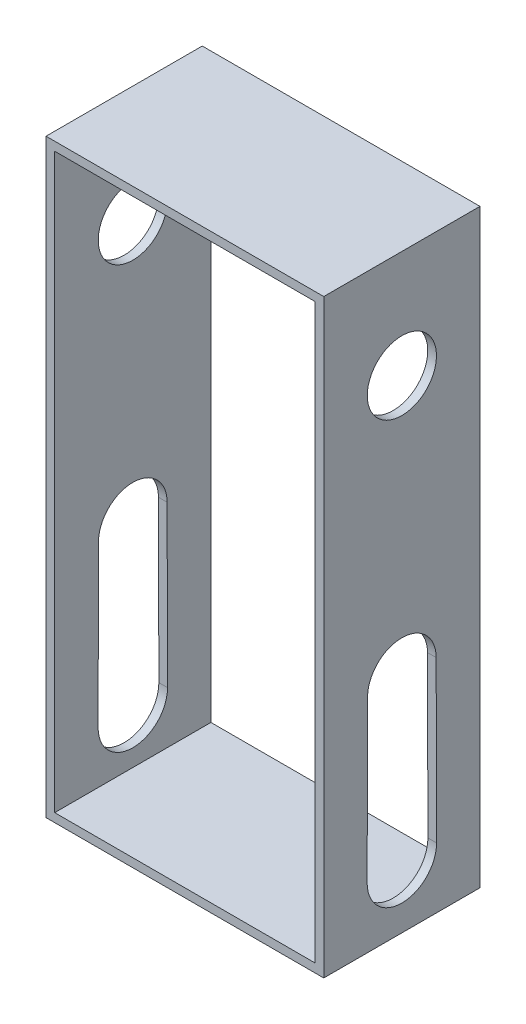
ISO-10303-21;
HEADER;
FILE_DESCRIPTION(('STEP AP214'),'2;1');
FILE_NAME('part.step','',(''),(''),'','','');
FILE_SCHEMA(('AUTOMOTIVE_DESIGN { 1 0 10303 214 1 1 1 1 }'));
ENDSEC;
DATA;
#1=APPLICATION_CONTEXT('core data for automotive mechanical design processes');
#2=APPLICATION_PROTOCOL_DEFINITION('international standard','automotive_design',2000,#1);
#3=PRODUCT_CONTEXT('',#1,'mechanical');
#4=PRODUCT('Part','Part','',(#3));
#5=PRODUCT_RELATED_PRODUCT_CATEGORY('part','',(#4));
#6=PRODUCT_DEFINITION_FORMATION('','',#4);
#7=PRODUCT_DEFINITION_CONTEXT('part definition',#1,'design');
#8=PRODUCT_DEFINITION('design','',#6,#7);
#9=PRODUCT_DEFINITION_SHAPE('','',#8);
#10=(LENGTH_UNIT() NAMED_UNIT(*) SI_UNIT(.MILLI.,.METRE.));
#11=(NAMED_UNIT(*) PLANE_ANGLE_UNIT() SI_UNIT($,.RADIAN.));
#12=(NAMED_UNIT(*) SI_UNIT($,.STERADIAN.) SOLID_ANGLE_UNIT());
#13=UNCERTAINTY_MEASURE_WITH_UNIT(LENGTH_MEASURE(1.E-05),#10,'distance_accuracy_value','');
#14=(GEOMETRIC_REPRESENTATION_CONTEXT(3) GLOBAL_UNCERTAINTY_ASSIGNED_CONTEXT((#13)) GLOBAL_UNIT_ASSIGNED_CONTEXT((#10,
#11,#12)) REPRESENTATION_CONTEXT('',''));
#15=CARTESIAN_POINT('',(0.,0.,0.));
#16=DIRECTION('',(0.,0.,1.));
#17=DIRECTION('',(1.,0.,0.));
#18=AXIS2_PLACEMENT_3D('',#15,#16,#17);
#19=CARTESIAN_POINT('',(0.,0.,114.3));
#20=DIRECTION('',(0.,0.,-1.));
#21=DIRECTION('',(-1.,0.,0.));
#22=AXIS2_PLACEMENT_3D('',#19,#20,#21);
#23=PLANE('',#22);
#24=DIRECTION('',(0.,1.,0.));
#25=VECTOR('',#24,1.);
#26=CARTESIAN_POINT('',(101.6,-215.9,114.3));
#27=LINE('',#26,#25);
#28=CARTESIAN_POINT('',(101.6,-215.9,114.3));
#29=VERTEX_POINT('',#28);
#30=CARTESIAN_POINT('',(101.6,215.9,114.3));
#31=VERTEX_POINT('',#30);
#32=EDGE_CURVE('E269',#29,#31,#27,.T.);
#33=ORIENTED_EDGE('',*,*,#32,.T.);
#34=DIRECTION('',(-1.,0.,0.));
#35=VECTOR('',#34,1.);
#36=CARTESIAN_POINT('',(-101.6,215.9,114.3));
#37=LINE('',#36,#35);
#38=CARTESIAN_POINT('',(-101.6,215.9,114.3));
#39=VERTEX_POINT('',#38);
#40=EDGE_CURVE('E273',#31,#39,#37,.T.);
#41=ORIENTED_EDGE('',*,*,#40,.T.);
#42=DIRECTION('',(0.,-1.,0.));
#43=VECTOR('',#42,1.);
#44=CARTESIAN_POINT('',(-101.6,-215.9,114.3));
#45=LINE('',#44,#43);
#46=CARTESIAN_POINT('',(-101.6,-215.9,114.3));
#47=VERTEX_POINT('',#46);
#48=EDGE_CURVE('E277',#39,#47,#45,.T.);
#49=ORIENTED_EDGE('',*,*,#48,.T.);
#50=DIRECTION('',(1.,0.,0.));
#51=VECTOR('',#50,1.);
#52=CARTESIAN_POINT('',(-101.6,-215.9,114.3));
#53=LINE('',#52,#51);
#54=EDGE_CURVE('E280',#47,#29,#53,.T.);
#55=ORIENTED_EDGE('',*,*,#54,.T.);
#56=EDGE_LOOP('',(#33,#41,#49,#55));
#57=FACE_BOUND('',#56,.T.);
#58=DIRECTION('',(0.,-1.,0.));
#59=VECTOR('',#58,1.);
#60=CARTESIAN_POINT('',(-95.25,-209.55,114.3));
#61=LINE('',#60,#59);
#62=CARTESIAN_POINT('',(-95.25,209.55,114.3));
#63=VERTEX_POINT('',#62);
#64=CARTESIAN_POINT('',(-95.25,-209.55,114.3));
#65=VERTEX_POINT('',#64);
#66=EDGE_CURVE('E226',#63,#65,#61,.T.);
#67=ORIENTED_EDGE('',*,*,#66,.F.);
#68=DIRECTION('',(-1.,0.,0.));
#69=VECTOR('',#68,1.);
#70=CARTESIAN_POINT('',(95.25,209.55,114.3));
#71=LINE('',#70,#69);
#72=CARTESIAN_POINT('',(95.25,209.55,114.3));
#73=VERTEX_POINT('',#72);
#74=EDGE_CURVE('E237',#73,#63,#71,.T.);
#75=ORIENTED_EDGE('',*,*,#74,.F.);
#76=DIRECTION('',(0.,1.,0.));
#77=VECTOR('',#76,1.);
#78=CARTESIAN_POINT('',(95.25,-209.55,114.3));
#79=LINE('',#78,#77);
#80=CARTESIAN_POINT('',(95.25,-209.55,114.3));
#81=VERTEX_POINT('',#80);
#82=EDGE_CURVE('E233',#81,#73,#79,.T.);
#83=ORIENTED_EDGE('',*,*,#82,.F.);
#84=DIRECTION('',(1.,0.,0.));
#85=VECTOR('',#84,1.);
#86=CARTESIAN_POINT('',(95.25,-209.55,114.3));
#87=LINE('',#86,#85);
#88=EDGE_CURVE('E229',#65,#81,#87,.T.);
#89=ORIENTED_EDGE('',*,*,#88,.F.);
#90=EDGE_LOOP('',(#67,#75,#83,#89));
#91=FACE_BOUND('',#90,.T.);
#92=ADVANCED_FACE('F39',(#57,#91),#23,.F.);
#93=CARTESIAN_POINT('',(0.,0.,0.));
#94=DIRECTION('',(0.,0.,-1.));
#95=DIRECTION('',(-1.,0.,0.));
#96=AXIS2_PLACEMENT_3D('',#93,#94,#95);
#97=PLANE('',#96);
#98=DIRECTION('',(0.,1.,0.));
#99=VECTOR('',#98,1.);
#100=CARTESIAN_POINT('',(101.6,-215.9,0.));
#101=LINE('',#100,#99);
#102=CARTESIAN_POINT('',(101.6,-215.9,0.));
#103=VERTEX_POINT('',#102);
#104=CARTESIAN_POINT('',(101.6,215.9,0.));
#105=VERTEX_POINT('',#104);
#106=EDGE_CURVE('E268',#103,#105,#101,.T.);
#107=ORIENTED_EDGE('',*,*,#106,.F.);
#108=DIRECTION('',(1.,0.,0.));
#109=VECTOR('',#108,1.);
#110=CARTESIAN_POINT('',(-101.6,-215.9,0.));
#111=LINE('',#110,#109);
#112=CARTESIAN_POINT('',(-101.6,-215.9,0.));
#113=VERTEX_POINT('',#112);
#114=EDGE_CURVE('E274',#113,#103,#111,.T.);
#115=ORIENTED_EDGE('',*,*,#114,.F.);
#116=DIRECTION('',(0.,-1.,0.));
#117=VECTOR('',#116,1.);
#118=CARTESIAN_POINT('',(-101.6,-215.9,0.));
#119=LINE('',#118,#117);
#120=CARTESIAN_POINT('',(-101.6,215.9,0.));
#121=VERTEX_POINT('',#120);
#122=EDGE_CURVE('E290',#121,#113,#119,.T.);
#123=ORIENTED_EDGE('',*,*,#122,.F.);
#124=DIRECTION('',(-1.,0.,0.));
#125=VECTOR('',#124,1.);
#126=CARTESIAN_POINT('',(-101.6,215.9,0.));
#127=LINE('',#126,#125);
#128=EDGE_CURVE('E287',#105,#121,#127,.T.);
#129=ORIENTED_EDGE('',*,*,#128,.F.);
#130=EDGE_LOOP('',(#107,#115,#123,#129));
#131=FACE_BOUND('',#130,.T.);
#132=DIRECTION('',(-1.,0.,0.));
#133=VECTOR('',#132,1.);
#134=CARTESIAN_POINT('',(95.25,209.55,0.));
#135=LINE('',#134,#133);
#136=CARTESIAN_POINT('',(95.25,209.55,0.));
#137=VERTEX_POINT('',#136);
#138=CARTESIAN_POINT('',(-95.25,209.55,0.));
#139=VERTEX_POINT('',#138);
#140=EDGE_CURVE('E230',#137,#139,#135,.T.);
#141=ORIENTED_EDGE('',*,*,#140,.T.);
#142=DIRECTION('',(0.,-1.,0.));
#143=VECTOR('',#142,1.);
#144=CARTESIAN_POINT('',(-95.25,-209.55,0.));
#145=LINE('',#144,#143);
#146=CARTESIAN_POINT('',(-95.25,-209.55,0.));
#147=VERTEX_POINT('',#146);
#148=EDGE_CURVE('E225',#139,#147,#145,.T.);
#149=ORIENTED_EDGE('',*,*,#148,.T.);
#150=DIRECTION('',(1.,0.,0.));
#151=VECTOR('',#150,1.);
#152=CARTESIAN_POINT('',(95.25,-209.55,0.));
#153=LINE('',#152,#151);
#154=CARTESIAN_POINT('',(95.25,-209.55,0.));
#155=VERTEX_POINT('',#154);
#156=EDGE_CURVE('E244',#147,#155,#153,.T.);
#157=ORIENTED_EDGE('',*,*,#156,.T.);
#158=DIRECTION('',(0.,1.,0.));
#159=VECTOR('',#158,1.);
#160=CARTESIAN_POINT('',(95.25,-209.55,0.));
#161=LINE('',#160,#159);
#162=EDGE_CURVE('E248',#155,#137,#161,.T.);
#163=ORIENTED_EDGE('',*,*,#162,.T.);
#164=EDGE_LOOP('',(#141,#149,#157,#163));
#165=FACE_BOUND('',#164,.T.);
#166=ADVANCED_FACE('F371',(#131,#165),#97,.T.);
#167=CARTESIAN_POINT('',(101.6,-215.9,114.3));
#168=DIRECTION('',(-1.,0.,0.));
#169=DIRECTION('',(0.,0.,1.));
#170=AXIS2_PLACEMENT_3D('',#167,#168,#169);
#171=PLANE('',#170);
#172=CARTESIAN_POINT('',(101.6,137.21314434305,57.15));
#173=DIRECTION('',(-1.,0.,0.));
#174=DIRECTION('',(0.,0.,1.));
#175=AXIS2_PLACEMENT_3D('',#172,#173,#174);
#176=CIRCLE('',#175,25.313218752407);
#177=CARTESIAN_POINT('',(101.6,137.21314434305,82.463218752407));
#178=VERTEX_POINT('',#177);
#179=EDGE_CURVE('E221',#178,#178,#176,.T.);
#180=ORIENTED_EDGE('',*,*,#179,.T.);
#181=EDGE_LOOP('',(#180));
#182=FACE_BOUND('',#181,.T.);
#183=CARTESIAN_POINT('',(101.6,-171.608124436315,57.15));
#184=DIRECTION('',(-1.,0.,0.));
#185=DIRECTION('',(0.,0.,1.));
#186=AXIS2_PLACEMENT_3D('',#183,#184,#185);
#187=CIRCLE('',#186,25.4);
#188=CARTESIAN_POINT('',(101.6,-171.608124436315,31.75));
#189=VERTEX_POINT('',#188);
#190=CARTESIAN_POINT('',(101.6,-171.608124436315,82.55));
#191=VERTEX_POINT('',#190);
#192=EDGE_CURVE('E180',#189,#191,#187,.T.);
#193=ORIENTED_EDGE('',*,*,#192,.T.);
#194=DIRECTION('',(0.,0.999996805025939,-0.0025278326516238));
#195=VECTOR('',#194,1.);
#196=CARTESIAN_POINT('',(101.6,-215.97997540793,82.6621649720632));
#197=LINE('',#196,#195);
#198=CARTESIAN_POINT('',(101.6,-53.975,82.2526421970869));
#199=VERTEX_POINT('',#198);
#200=EDGE_CURVE('E209',#191,#199,#197,.T.);
#201=ORIENTED_EDGE('',*,*,#200,.T.);
#202=CARTESIAN_POINT('',(101.6,-53.975,57.1499999999924));
#203=DIRECTION('',(-1.,0.,0.));
#204=DIRECTION('',(0.,0.,1.));
#205=AXIS2_PLACEMENT_3D('',#202,#203,#204);
#206=CIRCLE('',#205,25.1026421970945);
#207=CARTESIAN_POINT('',(101.6,-53.975,32.0473578028979));
#208=VERTEX_POINT('',#207);
#209=EDGE_CURVE('E198',#199,#208,#206,.T.);
#210=ORIENTED_EDGE('',*,*,#209,.T.);
#211=DIRECTION('',(0.,0.999996805025939,0.00252783265149498));
#212=VECTOR('',#211,1.);
#213=CARTESIAN_POINT('',(101.6,-215.691045058988,31.6385653978461));
#214=LINE('',#213,#212);
#215=EDGE_CURVE('E184',#189,#208,#214,.T.);
#216=ORIENTED_EDGE('',*,*,#215,.F.);
#217=EDGE_LOOP('',(#193,#201,#210,#216));
#218=FACE_BOUND('',#217,.T.);
#219=ORIENTED_EDGE('',*,*,#106,.T.);
#220=DIRECTION('',(0.,0.,-1.));
#221=VECTOR('',#220,1.);
#222=CARTESIAN_POINT('',(101.6,215.9,114.3));
#223=LINE('',#222,#221);
#224=EDGE_CURVE('E306',#31,#105,#223,.T.);
#225=ORIENTED_EDGE('',*,*,#224,.F.);
#226=ORIENTED_EDGE('',*,*,#32,.F.);
#227=DIRECTION('',(0.,0.,-1.));
#228=VECTOR('',#227,1.);
#229=CARTESIAN_POINT('',(101.6,-215.9,114.3));
#230=LINE('',#229,#228);
#231=EDGE_CURVE('E283',#29,#103,#230,.T.);
#232=ORIENTED_EDGE('',*,*,#231,.T.);
#233=EDGE_LOOP('',(#219,#225,#226,#232));
#234=FACE_BOUND('',#233,.T.);
#235=ADVANCED_FACE('F41',(#182,#218,#234),#171,.F.);
#236=CARTESIAN_POINT('',(-101.6,215.9,114.3));
#237=DIRECTION('',(0.,-1.,0.));
#238=DIRECTION('',(0.,0.,-1.));
#239=AXIS2_PLACEMENT_3D('',#236,#237,#238);
#240=PLANE('',#239);
#241=ORIENTED_EDGE('',*,*,#128,.T.);
#242=DIRECTION('',(0.,0.,-1.));
#243=VECTOR('',#242,1.);
#244=CARTESIAN_POINT('',(-101.6,215.9,114.3));
#245=LINE('',#244,#243);
#246=EDGE_CURVE('E302',#39,#121,#245,.T.);
#247=ORIENTED_EDGE('',*,*,#246,.F.);
#248=ORIENTED_EDGE('',*,*,#40,.F.);
#249=ORIENTED_EDGE('',*,*,#224,.T.);
#250=EDGE_LOOP('',(#241,#247,#248,#249));
#251=FACE_BOUND('',#250,.T.);
#252=ADVANCED_FACE('F388',(#251),#240,.F.);
#253=CARTESIAN_POINT('',(-101.6,-215.9,114.3));
#254=DIRECTION('',(1.,0.,0.));
#255=DIRECTION('',(0.,0.,-1.));
#256=AXIS2_PLACEMENT_3D('',#253,#254,#255);
#257=PLANE('',#256);
#258=CARTESIAN_POINT('',(-101.6,137.21314434305,57.15));
#259=DIRECTION('',(1.,0.,0.));
#260=DIRECTION('',(0.,0.,-1.));
#261=AXIS2_PLACEMENT_3D('',#258,#259,#260);
#262=CIRCLE('',#261,25.313218752407);
#263=CARTESIAN_POINT('',(-101.6,137.21314434305,31.836781247593));
#264=VERTEX_POINT('',#263);
#265=EDGE_CURVE('E217',#264,#264,#262,.T.);
#266=ORIENTED_EDGE('',*,*,#265,.T.);
#267=EDGE_LOOP('',(#266));
#268=FACE_BOUND('',#267,.T.);
#269=CARTESIAN_POINT('',(-101.6,-53.975,57.1499999999924));
#270=DIRECTION('',(1.,0.,0.));
#271=DIRECTION('',(0.,0.,-1.));
#272=AXIS2_PLACEMENT_3D('',#269,#270,#271);
#273=CIRCLE('',#272,25.1026421970945);
#274=CARTESIAN_POINT('',(-101.6,-53.975,32.0473578028979));
#275=VERTEX_POINT('',#274);
#276=CARTESIAN_POINT('',(-101.6,-53.975,82.2526421970869));
#277=VERTEX_POINT('',#276);
#278=EDGE_CURVE('E194',#275,#277,#273,.T.);
#279=ORIENTED_EDGE('',*,*,#278,.T.);
#280=DIRECTION('',(0.,-0.999996805025939,0.0025278326516238));
#281=VECTOR('',#280,1.);
#282=CARTESIAN_POINT('',(-101.6,-215.97997540793,82.6621649720632));
#283=LINE('',#282,#281);
#284=CARTESIAN_POINT('',(-101.6,-171.608124436315,82.55));
#285=VERTEX_POINT('',#284);
#286=EDGE_CURVE('E205',#277,#285,#283,.T.);
#287=ORIENTED_EDGE('',*,*,#286,.T.);
#288=CARTESIAN_POINT('',(-101.6,-171.608124436315,57.15));
#289=DIRECTION('',(1.,0.,0.));
#290=DIRECTION('',(0.,0.,-1.));
#291=AXIS2_PLACEMENT_3D('',#288,#289,#290);
#292=CIRCLE('',#291,25.4);
#293=CARTESIAN_POINT('',(-101.6,-171.608124436315,31.75));
#294=VERTEX_POINT('',#293);
#295=EDGE_CURVE('E160',#285,#294,#292,.T.);
#296=ORIENTED_EDGE('',*,*,#295,.T.);
#297=DIRECTION('',(0.,-0.999996805025939,-0.00252783265149498));
#298=VECTOR('',#297,1.);
#299=CARTESIAN_POINT('',(-101.6,-215.691045058988,31.6385653978461));
#300=LINE('',#299,#298);
#301=EDGE_CURVE('E169',#275,#294,#300,.T.);
#302=ORIENTED_EDGE('',*,*,#301,.F.);
#303=EDGE_LOOP('',(#279,#287,#296,#302));
#304=FACE_BOUND('',#303,.T.);
#305=ORIENTED_EDGE('',*,*,#122,.T.);
#306=DIRECTION('',(0.,0.,-1.));
#307=VECTOR('',#306,1.);
#308=CARTESIAN_POINT('',(-101.6,-215.9,114.3));
#309=LINE('',#308,#307);
#310=EDGE_CURVE('E298',#47,#113,#309,.T.);
#311=ORIENTED_EDGE('',*,*,#310,.F.);
#312=ORIENTED_EDGE('',*,*,#48,.F.);
#313=ORIENTED_EDGE('',*,*,#246,.T.);
#314=EDGE_LOOP('',(#305,#311,#312,#313));
#315=FACE_BOUND('',#314,.T.);
#316=ADVANCED_FACE('F347',(#268,#304,#315),#257,.F.);
#317=CARTESIAN_POINT('',(-101.6,-215.9,114.3));
#318=DIRECTION('',(0.,1.,0.));
#319=DIRECTION('',(0.,0.,1.));
#320=AXIS2_PLACEMENT_3D('',#317,#318,#319);
#321=PLANE('',#320);
#322=ORIENTED_EDGE('',*,*,#114,.T.);
#323=ORIENTED_EDGE('',*,*,#231,.F.);
#324=ORIENTED_EDGE('',*,*,#54,.F.);
#325=ORIENTED_EDGE('',*,*,#310,.T.);
#326=EDGE_LOOP('',(#322,#323,#324,#325));
#327=FACE_BOUND('',#326,.T.);
#328=ADVANCED_FACE('F383',(#327),#321,.F.);
#329=CARTESIAN_POINT('',(-95.25,-209.55,114.3));
#330=DIRECTION('',(1.,0.,0.));
#331=DIRECTION('',(0.,0.,-1.));
#332=AXIS2_PLACEMENT_3D('',#329,#330,#331);
#333=PLANE('',#332);
#334=CARTESIAN_POINT('',(-95.25,137.21314434305,57.15));
#335=DIRECTION('',(1.,0.,0.));
#336=DIRECTION('',(0.,0.,-1.));
#337=AXIS2_PLACEMENT_3D('',#334,#335,#336);
#338=CIRCLE('',#337,25.313218752407);
#339=CARTESIAN_POINT('',(-95.25,137.21314434305,31.836781247593));
#340=VERTEX_POINT('',#339);
#341=EDGE_CURVE('E213',#340,#340,#338,.T.);
#342=ORIENTED_EDGE('',*,*,#341,.F.);
#343=EDGE_LOOP('',(#342));
#344=FACE_BOUND('',#343,.T.);
#345=DIRECTION('',(0.,-0.999996805025939,0.0025278326516238));
#346=VECTOR('',#345,1.);
#347=CARTESIAN_POINT('',(-95.25,-209.630015984035,82.6461132860103));
#348=LINE('',#347,#346);
#349=CARTESIAN_POINT('',(-95.25,-53.975,82.2526421970869));
#350=VERTEX_POINT('',#349);
#351=CARTESIAN_POINT('',(-95.25,-171.608124436315,82.55));
#352=VERTEX_POINT('',#351);
#353=EDGE_CURVE('E202',#350,#352,#348,.T.);
#354=ORIENTED_EDGE('',*,*,#353,.F.);
#355=CARTESIAN_POINT('',(-95.25,-53.975,57.1499999999924));
#356=DIRECTION('',(1.,0.,0.));
#357=DIRECTION('',(0.,0.,-1.));
#358=AXIS2_PLACEMENT_3D('',#355,#356,#357);
#359=CIRCLE('',#358,25.1026421970945);
#360=CARTESIAN_POINT('',(-95.25,-53.975,32.0473578028979));
#361=VERTEX_POINT('',#360);
#362=EDGE_CURVE('E178',#361,#350,#359,.T.);
#363=ORIENTED_EDGE('',*,*,#362,.F.);
#364=DIRECTION('',(0.,-0.999996805025939,-0.00252783265149498));
#365=VECTOR('',#364,1.);
#366=CARTESIAN_POINT('',(-95.25,-209.341085635093,31.6546170838982));
#367=LINE('',#366,#365);
#368=CARTESIAN_POINT('',(-95.25,-171.608124436315,31.75));
#369=VERTEX_POINT('',#368);
#370=EDGE_CURVE('E166',#361,#369,#367,.T.);
#371=ORIENTED_EDGE('',*,*,#370,.T.);
#372=CARTESIAN_POINT('',(-95.25,-171.608124436315,57.15));
#373=DIRECTION('',(1.,0.,0.));
#374=DIRECTION('',(0.,0.,-1.));
#375=AXIS2_PLACEMENT_3D('',#372,#373,#374);
#376=CIRCLE('',#375,25.4);
#377=EDGE_CURVE('E151',#352,#369,#376,.T.);
#378=ORIENTED_EDGE('',*,*,#377,.F.);
#379=EDGE_LOOP('',(#354,#363,#371,#378));
#380=FACE_BOUND('',#379,.T.);
#381=ORIENTED_EDGE('',*,*,#148,.F.);
#382=DIRECTION('',(0.,0.,-1.));
#383=VECTOR('',#382,1.);
#384=CARTESIAN_POINT('',(-95.25,209.55,114.3));
#385=LINE('',#384,#383);
#386=EDGE_CURVE('E240',#63,#139,#385,.T.);
#387=ORIENTED_EDGE('',*,*,#386,.F.);
#388=ORIENTED_EDGE('',*,*,#66,.T.);
#389=DIRECTION('',(0.,0.,-1.));
#390=VECTOR('',#389,1.);
#391=CARTESIAN_POINT('',(-95.25,-209.55,114.3));
#392=LINE('',#391,#390);
#393=EDGE_CURVE('E264',#65,#147,#392,.T.);
#394=ORIENTED_EDGE('',*,*,#393,.T.);
#395=EDGE_LOOP('',(#381,#387,#388,#394));
#396=FACE_BOUND('',#395,.T.);
#397=ADVANCED_FACE('F176',(#344,#380,#396),#333,.T.);
#398=CARTESIAN_POINT('',(95.25,-209.55,114.3));
#399=DIRECTION('',(0.,1.,0.));
#400=DIRECTION('',(0.,0.,1.));
#401=AXIS2_PLACEMENT_3D('',#398,#399,#400);
#402=PLANE('',#401);
#403=ORIENTED_EDGE('',*,*,#156,.F.);
#404=ORIENTED_EDGE('',*,*,#393,.F.);
#405=ORIENTED_EDGE('',*,*,#88,.T.);
#406=DIRECTION('',(0.,0.,-1.));
#407=VECTOR('',#406,1.);
#408=CARTESIAN_POINT('',(95.25,-209.55,114.3));
#409=LINE('',#408,#407);
#410=EDGE_CURVE('E261',#81,#155,#409,.T.);
#411=ORIENTED_EDGE('',*,*,#410,.T.);
#412=EDGE_LOOP('',(#403,#404,#405,#411));
#413=FACE_BOUND('',#412,.T.);
#414=ADVANCED_FACE('F420',(#413),#402,.T.);
#415=CARTESIAN_POINT('',(95.25,-209.55,114.3));
#416=DIRECTION('',(-1.,0.,0.));
#417=DIRECTION('',(0.,0.,1.));
#418=AXIS2_PLACEMENT_3D('',#415,#416,#417);
#419=PLANE('',#418);
#420=CARTESIAN_POINT('',(95.25,137.21314434305,57.15));
#421=DIRECTION('',(-1.,0.,0.));
#422=DIRECTION('',(0.,0.,1.));
#423=AXIS2_PLACEMENT_3D('',#420,#421,#422);
#424=CIRCLE('',#423,25.313218752407);
#425=CARTESIAN_POINT('',(95.25,137.21314434305,82.463218752407));
#426=VERTEX_POINT('',#425);
#427=EDGE_CURVE('E43',#426,#426,#424,.T.);
#428=ORIENTED_EDGE('',*,*,#427,.F.);
#429=EDGE_LOOP('',(#428));
#430=FACE_BOUND('',#429,.T.);
#431=DIRECTION('',(0.,0.999996805025939,-0.0025278326516238));
#432=VECTOR('',#431,1.);
#433=CARTESIAN_POINT('',(95.25,-209.630015984035,82.6461132860103));
#434=LINE('',#433,#432);
#435=CARTESIAN_POINT('',(95.25,-171.608124436315,82.55));
#436=VERTEX_POINT('',#435);
#437=CARTESIAN_POINT('',(95.25,-53.975,82.2526421970869));
#438=VERTEX_POINT('',#437);
#439=EDGE_CURVE('E11',#436,#438,#434,.T.);
#440=ORIENTED_EDGE('',*,*,#439,.F.);
#441=CARTESIAN_POINT('',(95.25,-171.608124436315,57.15));
#442=DIRECTION('',(-1.,0.,0.));
#443=DIRECTION('',(0.,0.,1.));
#444=AXIS2_PLACEMENT_3D('',#441,#442,#443);
#445=CIRCLE('',#444,25.4);
#446=CARTESIAN_POINT('',(95.25,-171.608124436315,31.75));
#447=VERTEX_POINT('',#446);
#448=EDGE_CURVE('E310',#447,#436,#445,.T.);
#449=ORIENTED_EDGE('',*,*,#448,.F.);
#450=DIRECTION('',(0.,0.999996805025939,0.00252783265149498));
#451=VECTOR('',#450,1.);
#452=CARTESIAN_POINT('',(95.25,-209.341085635093,31.6546170838982));
#453=LINE('',#452,#451);
#454=CARTESIAN_POINT('',(95.25,-53.975,32.0473578028979));
#455=VERTEX_POINT('',#454);
#456=EDGE_CURVE('E313',#447,#455,#453,.T.);
#457=ORIENTED_EDGE('',*,*,#456,.T.);
#458=CARTESIAN_POINT('',(95.25,-53.975,57.1499999999924));
#459=DIRECTION('',(-1.,0.,0.));
#460=DIRECTION('',(0.,0.,1.));
#461=AXIS2_PLACEMENT_3D('',#458,#459,#460);
#462=CIRCLE('',#461,25.1026421970945);
#463=EDGE_CURVE('E49',#438,#455,#462,.T.);
#464=ORIENTED_EDGE('',*,*,#463,.F.);
#465=EDGE_LOOP('',(#440,#449,#457,#464));
#466=FACE_BOUND('',#465,.T.);
#467=ORIENTED_EDGE('',*,*,#162,.F.);
#468=ORIENTED_EDGE('',*,*,#410,.F.);
#469=ORIENTED_EDGE('',*,*,#82,.T.);
#470=DIRECTION('',(0.,0.,-1.));
#471=VECTOR('',#470,1.);
#472=CARTESIAN_POINT('',(95.25,209.55,114.3));
#473=LINE('',#472,#471);
#474=EDGE_CURVE('E258',#73,#137,#473,.T.);
#475=ORIENTED_EDGE('',*,*,#474,.T.);
#476=EDGE_LOOP('',(#467,#468,#469,#475));
#477=FACE_BOUND('',#476,.T.);
#478=ADVANCED_FACE('F337',(#430,#466,#477),#419,.T.);
#479=CARTESIAN_POINT('',(95.25,209.55,114.3));
#480=DIRECTION('',(0.,-1.,0.));
#481=DIRECTION('',(0.,0.,-1.));
#482=AXIS2_PLACEMENT_3D('',#479,#480,#481);
#483=PLANE('',#482);
#484=ORIENTED_EDGE('',*,*,#140,.F.);
#485=ORIENTED_EDGE('',*,*,#474,.F.);
#486=ORIENTED_EDGE('',*,*,#74,.T.);
#487=ORIENTED_EDGE('',*,*,#386,.T.);
#488=EDGE_LOOP('',(#484,#485,#486,#487));
#489=FACE_BOUND('',#488,.T.);
#490=ADVANCED_FACE('F411',(#489),#483,.T.);
#491=CARTESIAN_POINT('',(-204.216,-171.608124436315,57.15));
#492=DIRECTION('',(1.,0.,0.));
#493=DIRECTION('',(0.,0.,-1.));
#494=AXIS2_PLACEMENT_3D('',#491,#492,#493);
#495=CYLINDRICAL_SURFACE('',#494,25.4);
#496=DIRECTION('',(1.,0.,0.));
#497=VECTOR('',#496,1.);
#498=CARTESIAN_POINT('',(-204.216,-171.608124436315,31.75));
#499=LINE('',#498,#497);
#500=EDGE_CURVE('E173',#447,#189,#499,.T.);
#501=ORIENTED_EDGE('',*,*,#500,.F.);
#502=ORIENTED_EDGE('',*,*,#448,.T.);
#503=DIRECTION('',(1.,0.,0.));
#504=VECTOR('',#503,1.);
#505=CARTESIAN_POINT('',(-204.216,-171.608124436315,82.55));
#506=LINE('',#505,#504);
#507=EDGE_CURVE('E56',#436,#191,#506,.T.);
#508=ORIENTED_EDGE('',*,*,#507,.T.);
#509=ORIENTED_EDGE('',*,*,#192,.F.);
#510=EDGE_LOOP('',(#501,#502,#508,#509));
#511=FACE_BOUND('',#510,.T.);
#512=ADVANCED_FACE('F339',(#511),#495,.F.);
#513=CARTESIAN_POINT('',(-204.216,-0.0813549955212232,32.1835923537142));
#514=DIRECTION('',(0.,-0.00252783265149498,0.999996805025939));
#515=DIRECTION('',(0.,-0.999996805025939,-0.00252783265149498));
#516=AXIS2_PLACEMENT_3D('',#513,#514,#515);
#517=PLANE('',#516);
#518=ORIENTED_EDGE('',*,*,#215,.T.);
#519=DIRECTION('',(1.,0.,0.));
#520=VECTOR('',#519,1.);
#521=CARTESIAN_POINT('',(-204.216,-53.975,32.0473578028979));
#522=LINE('',#521,#520);
#523=EDGE_CURVE('E172',#455,#208,#522,.T.);
#524=ORIENTED_EDGE('',*,*,#523,.F.);
#525=ORIENTED_EDGE('',*,*,#456,.F.);
#526=ORIENTED_EDGE('',*,*,#500,.T.);
#527=EDGE_LOOP('',(#518,#524,#525,#526));
#528=FACE_BOUND('',#527,.T.);
#529=ADVANCED_FACE('F330',(#528),#517,.T.);
#530=CARTESIAN_POINT('',(-204.216,-53.975,57.1499999999924));
#531=DIRECTION('',(1.,0.,0.));
#532=DIRECTION('',(0.,0.,-1.));
#533=AXIS2_PLACEMENT_3D('',#530,#531,#532);
#534=CYLINDRICAL_SURFACE('',#533,25.1026421970945);
#535=DIRECTION('',(1.,0.,0.));
#536=VECTOR('',#535,1.);
#537=CARTESIAN_POINT('',(-204.216,-53.975,82.2526421970869));
#538=LINE('',#537,#536);
#539=EDGE_CURVE('E325',#438,#199,#538,.T.);
#540=ORIENTED_EDGE('',*,*,#539,.F.);
#541=ORIENTED_EDGE('',*,*,#463,.T.);
#542=ORIENTED_EDGE('',*,*,#523,.T.);
#543=ORIENTED_EDGE('',*,*,#209,.F.);
#544=EDGE_LOOP('',(#540,#541,#542,#543));
#545=FACE_BOUND('',#544,.T.);
#546=ADVANCED_FACE('F323',(#545),#534,.F.);
#547=CARTESIAN_POINT('',(-204.216,0.207575353427256,82.1156772763601));
#548=DIRECTION('',(0.,0.0025278326516238,0.999996805025939));
#549=DIRECTION('',(0.,-0.999996805025939,0.0025278326516238));
#550=AXIS2_PLACEMENT_3D('',#547,#548,#549);
#551=PLANE('',#550);
#552=ORIENTED_EDGE('',*,*,#507,.F.);
#553=ORIENTED_EDGE('',*,*,#439,.T.);
#554=ORIENTED_EDGE('',*,*,#539,.T.);
#555=ORIENTED_EDGE('',*,*,#200,.F.);
#556=EDGE_LOOP('',(#552,#553,#554,#555));
#557=FACE_BOUND('',#556,.T.);
#558=ADVANCED_FACE('F341',(#557),#551,.F.);
#559=CARTESIAN_POINT('',(-204.216,137.21314434305,57.15));
#560=DIRECTION('',(1.,0.,0.));
#561=DIRECTION('',(0.,0.,-1.));
#562=AXIS2_PLACEMENT_3D('',#559,#560,#561);
#563=CYLINDRICAL_SURFACE('',#562,25.313218752407);
#564=ORIENTED_EDGE('',*,*,#427,.T.);
#565=EDGE_LOOP('',(#564));
#566=FACE_BOUND('',#565,.T.);
#567=ORIENTED_EDGE('',*,*,#179,.F.);
#568=EDGE_LOOP('',(#567));
#569=FACE_BOUND('',#568,.T.);
#570=ADVANCED_FACE('F366',(#566,#569),#563,.F.);
#571=EDGE_CURVE('E161',#277,#350,#538,.T.);
#572=ORIENTED_EDGE('',*,*,#571,.T.);
#573=ORIENTED_EDGE('',*,*,#353,.T.);
#574=EDGE_CURVE('E154',#285,#352,#506,.T.);
#575=ORIENTED_EDGE('',*,*,#574,.F.);
#576=ORIENTED_EDGE('',*,*,#286,.F.);
#577=EDGE_LOOP('',(#572,#573,#575,#576));
#578=FACE_BOUND('',#577,.T.);
#579=ADVANCED_FACE('F351',(#578),#551,.F.);
#580=EDGE_CURVE('E335',#275,#361,#522,.T.);
#581=ORIENTED_EDGE('',*,*,#580,.T.);
#582=ORIENTED_EDGE('',*,*,#362,.T.);
#583=ORIENTED_EDGE('',*,*,#571,.F.);
#584=ORIENTED_EDGE('',*,*,#278,.F.);
#585=EDGE_LOOP('',(#581,#582,#583,#584));
#586=FACE_BOUND('',#585,.T.);
#587=ADVANCED_FACE('F358',(#586),#534,.F.);
#588=ORIENTED_EDGE('',*,*,#301,.T.);
#589=EDGE_CURVE('E64',#294,#369,#499,.T.);
#590=ORIENTED_EDGE('',*,*,#589,.T.);
#591=ORIENTED_EDGE('',*,*,#370,.F.);
#592=ORIENTED_EDGE('',*,*,#580,.F.);
#593=EDGE_LOOP('',(#588,#590,#591,#592));
#594=FACE_BOUND('',#593,.T.);
#595=ADVANCED_FACE('F164',(#594),#517,.T.);
#596=ORIENTED_EDGE('',*,*,#574,.T.);
#597=ORIENTED_EDGE('',*,*,#377,.T.);
#598=ORIENTED_EDGE('',*,*,#589,.F.);
#599=ORIENTED_EDGE('',*,*,#295,.F.);
#600=EDGE_LOOP('',(#596,#597,#598,#599));
#601=FACE_BOUND('',#600,.T.);
#602=ADVANCED_FACE('F152',(#601),#495,.F.);
#603=ORIENTED_EDGE('',*,*,#341,.T.);
#604=EDGE_LOOP('',(#603));
#605=FACE_BOUND('',#604,.T.);
#606=ORIENTED_EDGE('',*,*,#265,.F.);
#607=EDGE_LOOP('',(#606));
#608=FACE_BOUND('',#607,.T.);
#609=ADVANCED_FACE('F452',(#605,#608),#563,.F.);
#610=CLOSED_SHELL('',(#92,#166,#235,#252,#316,#328,#397,#414,#478,#490,#512,#529,#546,#558,#570,
#579,#587,#595,#602,#609));
#611=MANIFOLD_SOLID_BREP('B2',#610);
#612=ADVANCED_BREP_SHAPE_REPRESENTATION('',(#18,#611),#14);
#613=SHAPE_DEFINITION_REPRESENTATION(#9,#612);
ENDSEC;
END-ISO-10303-21;
